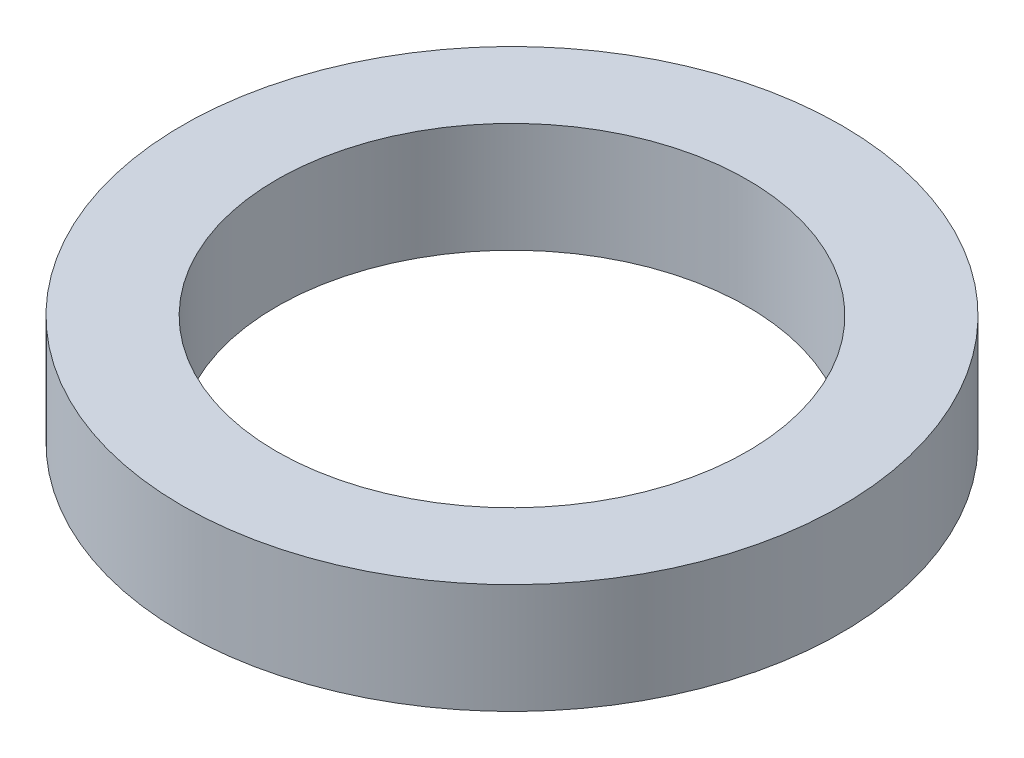
ISO-10303-21;
HEADER;
FILE_DESCRIPTION(('STEP AP214'),'2;1');
FILE_NAME('part.step','',(''),(''),'','','');
FILE_SCHEMA(('AUTOMOTIVE_DESIGN { 1 0 10303 214 1 1 1 1 }'));
ENDSEC;
DATA;
#1=APPLICATION_CONTEXT('core data for automotive mechanical design processes');
#2=APPLICATION_PROTOCOL_DEFINITION('international standard','automotive_design',2000,#1);
#3=PRODUCT_CONTEXT('',#1,'mechanical');
#4=PRODUCT('Part','Part','',(#3));
#5=PRODUCT_RELATED_PRODUCT_CATEGORY('part','',(#4));
#6=PRODUCT_DEFINITION_FORMATION('','',#4);
#7=PRODUCT_DEFINITION_CONTEXT('part definition',#1,'design');
#8=PRODUCT_DEFINITION('design','',#6,#7);
#9=PRODUCT_DEFINITION_SHAPE('','',#8);
#10=(LENGTH_UNIT() NAMED_UNIT(*) SI_UNIT(.MILLI.,.METRE.));
#11=(NAMED_UNIT(*) PLANE_ANGLE_UNIT() SI_UNIT($,.RADIAN.));
#12=(NAMED_UNIT(*) SI_UNIT($,.STERADIAN.) SOLID_ANGLE_UNIT());
#13=UNCERTAINTY_MEASURE_WITH_UNIT(LENGTH_MEASURE(1.E-05),#10,'distance_accuracy_value','');
#14=(GEOMETRIC_REPRESENTATION_CONTEXT(3) GLOBAL_UNCERTAINTY_ASSIGNED_CONTEXT((#13)) GLOBAL_UNIT_ASSIGNED_CONTEXT((#10,
#11,#12)) REPRESENTATION_CONTEXT('',''));
#15=CARTESIAN_POINT('',(0.,0.,0.));
#16=DIRECTION('',(0.,0.,1.));
#17=DIRECTION('',(1.,0.,0.));
#18=AXIS2_PLACEMENT_3D('',#15,#16,#17);
#19=CARTESIAN_POINT('',(0.,177.8,0.));
#20=DIRECTION('',(0.,1.,0.));
#21=DIRECTION('',(0.,0.,1.));
#22=AXIS2_PLACEMENT_3D('',#19,#20,#21);
#23=PLANE('',#22);
#24=CARTESIAN_POINT('',(0.,177.8,0.));
#25=DIRECTION('',(0.,1.,0.));
#26=DIRECTION('',(0.,0.,1.));
#27=AXIS2_PLACEMENT_3D('',#24,#25,#26);
#28=CIRCLE('',#27,533.4);
#29=CARTESIAN_POINT('',(0.,177.8,533.4));
#30=VERTEX_POINT('',#29);
#31=EDGE_CURVE('E10',#30,#30,#28,.T.);
#32=ORIENTED_EDGE('',*,*,#31,.T.);
#33=EDGE_LOOP('',(#32));
#34=FACE_BOUND('',#33,.T.);
#35=CARTESIAN_POINT('',(0.,177.8,0.));
#36=DIRECTION('',(0.,1.,0.));
#37=DIRECTION('',(0.,0.,1.));
#38=AXIS2_PLACEMENT_3D('',#35,#36,#37);
#39=CIRCLE('',#38,381.);
#40=CARTESIAN_POINT('',(0.,177.8,381.));
#41=VERTEX_POINT('',#40);
#42=EDGE_CURVE('E50',#41,#41,#39,.T.);
#43=ORIENTED_EDGE('',*,*,#42,.F.);
#44=EDGE_LOOP('',(#43));
#45=FACE_BOUND('',#44,.T.);
#46=ADVANCED_FACE('F37',(#34,#45),#23,.T.);
#47=CARTESIAN_POINT('',(0.,0.,0.));
#48=DIRECTION('',(0.,1.,0.));
#49=DIRECTION('',(0.,0.,1.));
#50=AXIS2_PLACEMENT_3D('',#47,#48,#49);
#51=PLANE('',#50);
#52=CARTESIAN_POINT('',(0.,0.,0.));
#53=DIRECTION('',(0.,1.,0.));
#54=DIRECTION('',(0.,0.,1.));
#55=AXIS2_PLACEMENT_3D('',#52,#53,#54);
#56=CIRCLE('',#55,533.4);
#57=CARTESIAN_POINT('',(0.,0.,533.4));
#58=VERTEX_POINT('',#57);
#59=EDGE_CURVE('E41',#58,#58,#56,.T.);
#60=ORIENTED_EDGE('',*,*,#59,.F.);
#61=EDGE_LOOP('',(#60));
#62=FACE_BOUND('',#61,.T.);
#63=CARTESIAN_POINT('',(0.,0.,0.));
#64=DIRECTION('',(0.,1.,0.));
#65=DIRECTION('',(0.,0.,1.));
#66=AXIS2_PLACEMENT_3D('',#63,#64,#65);
#67=CIRCLE('',#66,381.);
#68=CARTESIAN_POINT('',(0.,0.,381.));
#69=VERTEX_POINT('',#68);
#70=EDGE_CURVE('E52',#69,#69,#67,.T.);
#71=ORIENTED_EDGE('',*,*,#70,.T.);
#72=EDGE_LOOP('',(#71));
#73=FACE_BOUND('',#72,.T.);
#74=ADVANCED_FACE('F64',(#62,#73),#51,.F.);
#75=CARTESIAN_POINT('',(0.,177.8,0.));
#76=DIRECTION('',(0.,-1.,0.));
#77=DIRECTION('',(0.,0.,-1.));
#78=AXIS2_PLACEMENT_3D('',#75,#76,#77);
#79=CYLINDRICAL_SURFACE('',#78,533.4);
#80=ORIENTED_EDGE('',*,*,#31,.F.);
#81=EDGE_LOOP('',(#80));
#82=FACE_BOUND('',#81,.T.);
#83=ORIENTED_EDGE('',*,*,#59,.T.);
#84=EDGE_LOOP('',(#83));
#85=FACE_BOUND('',#84,.T.);
#86=ADVANCED_FACE('F39',(#82,#85),#79,.T.);
#87=CARTESIAN_POINT('',(0.,177.8,0.));
#88=DIRECTION('',(0.,-1.,0.));
#89=DIRECTION('',(0.,0.,-1.));
#90=AXIS2_PLACEMENT_3D('',#87,#88,#89);
#91=CYLINDRICAL_SURFACE('',#90,381.);
#92=ORIENTED_EDGE('',*,*,#42,.T.);
#93=EDGE_LOOP('',(#92));
#94=FACE_BOUND('',#93,.T.);
#95=ORIENTED_EDGE('',*,*,#70,.F.);
#96=EDGE_LOOP('',(#95));
#97=FACE_BOUND('',#96,.T.);
#98=ADVANCED_FACE('F60',(#94,#97),#91,.F.);
#99=CLOSED_SHELL('',(#46,#74,#86,#98));
#100=MANIFOLD_SOLID_BREP('B2',#99);
#101=ADVANCED_BREP_SHAPE_REPRESENTATION('',(#18,#100),#14);
#102=SHAPE_DEFINITION_REPRESENTATION(#9,#101);
ENDSEC;
END-ISO-10303-21;
